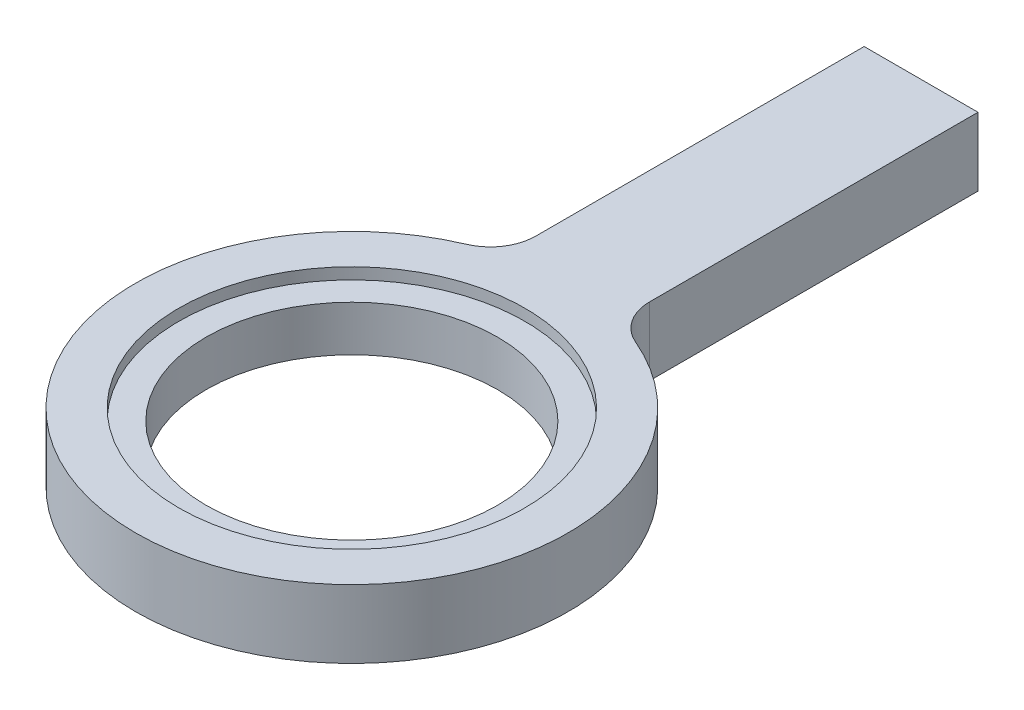
ISO-10303-21;
HEADER;
FILE_DESCRIPTION(('STEP AP214'),'2;1');
FILE_NAME('part.step','',(''),(''),'','','');
FILE_SCHEMA(('AUTOMOTIVE_DESIGN { 1 0 10303 214 1 1 1 1 }'));
ENDSEC;
DATA;
#1=APPLICATION_CONTEXT('core data for automotive mechanical design processes');
#2=APPLICATION_PROTOCOL_DEFINITION('international standard','automotive_design',2000,#1);
#3=PRODUCT_CONTEXT('',#1,'mechanical');
#4=PRODUCT('Part','Part','',(#3));
#5=PRODUCT_RELATED_PRODUCT_CATEGORY('part','',(#4));
#6=PRODUCT_DEFINITION_FORMATION('','',#4);
#7=PRODUCT_DEFINITION_CONTEXT('part definition',#1,'design');
#8=PRODUCT_DEFINITION('design','',#6,#7);
#9=PRODUCT_DEFINITION_SHAPE('','',#8);
#10=(LENGTH_UNIT() NAMED_UNIT(*) SI_UNIT(.MILLI.,.METRE.));
#11=(NAMED_UNIT(*) PLANE_ANGLE_UNIT() SI_UNIT($,.RADIAN.));
#12=(NAMED_UNIT(*) SI_UNIT($,.STERADIAN.) SOLID_ANGLE_UNIT());
#13=UNCERTAINTY_MEASURE_WITH_UNIT(LENGTH_MEASURE(1.E-05),#10,'distance_accuracy_value','');
#14=(GEOMETRIC_REPRESENTATION_CONTEXT(3) GLOBAL_UNCERTAINTY_ASSIGNED_CONTEXT((#13)) GLOBAL_UNIT_ASSIGNED_CONTEXT((#10,
#11,#12)) REPRESENTATION_CONTEXT('',''));
#15=CARTESIAN_POINT('',(0.,0.,0.));
#16=DIRECTION('',(0.,0.,1.));
#17=DIRECTION('',(1.,0.,0.));
#18=AXIS2_PLACEMENT_3D('',#15,#16,#17);
#19=CARTESIAN_POINT('',(0.,2.,0.));
#20=DIRECTION('',(0.,-1.,0.));
#21=DIRECTION('',(0.,0.,-1.));
#22=AXIS2_PLACEMENT_3D('',#19,#20,#21);
#23=CYLINDRICAL_SURFACE('',#22,9.5);
#24=CARTESIAN_POINT('',(0.,2.5,0.));
#25=DIRECTION('',(0.,1.,0.));
#26=DIRECTION('',(0.,0.,1.));
#27=AXIS2_PLACEMENT_3D('',#24,#25,#26);
#28=CIRCLE('',#27,9.5);
#29=CARTESIAN_POINT('',(-3.71739130434783,2.5,-8.742482593083));
#30=VERTEX_POINT('',#29);
#31=CARTESIAN_POINT('',(3.71739130434783,2.5,-8.742482593083));
#32=VERTEX_POINT('',#31);
#33=EDGE_CURVE('E142',#30,#32,#28,.T.);
#34=ORIENTED_EDGE('',*,*,#33,.F.);
#35=DIRECTION('',(0.,-1.,0.));
#36=VECTOR('',#35,1.);
#37=CARTESIAN_POINT('',(-3.71739130434783,2.,-8.742482593083));
#38=LINE('',#37,#36);
#39=CARTESIAN_POINT('',(-3.71739130434783,-0.5,-8.742482593083));
#40=VERTEX_POINT('',#39);
#41=EDGE_CURVE('E156',#30,#40,#38,.T.);
#42=ORIENTED_EDGE('',*,*,#41,.T.);
#43=CARTESIAN_POINT('',(0.,-0.5,0.));
#44=DIRECTION('',(0.,1.,0.));
#45=DIRECTION('',(0.,0.,1.));
#46=AXIS2_PLACEMENT_3D('',#43,#44,#45);
#47=CIRCLE('',#46,9.5);
#48=CARTESIAN_POINT('',(3.71739130434783,-0.5,-8.742482593083));
#49=VERTEX_POINT('',#48);
#50=EDGE_CURVE('E130',#40,#49,#47,.T.);
#51=ORIENTED_EDGE('',*,*,#50,.T.);
#52=DIRECTION('',(0.,-1.,0.));
#53=VECTOR('',#52,1.);
#54=CARTESIAN_POINT('',(3.71739130434783,2.,-8.742482593083));
#55=LINE('',#54,#53);
#56=EDGE_CURVE('E153',#49,#32,#55,.F.);
#57=ORIENTED_EDGE('',*,*,#56,.T.);
#58=EDGE_LOOP('',(#34,#42,#51,#57));
#59=FACE_BOUND('',#58,.T.);
#60=ADVANCED_FACE('F49',(#59),#23,.T.);
#61=CARTESIAN_POINT('',(0.,0.,0.));
#62=DIRECTION('',(0.,1.,0.));
#63=DIRECTION('',(0.,0.,1.));
#64=AXIS2_PLACEMENT_3D('',#61,#62,#63);
#65=PLANE('',#64);
#66=CARTESIAN_POINT('',(0.,0.,0.));
#67=DIRECTION('',(0.,1.,0.));
#68=DIRECTION('',(0.,0.,1.));
#69=AXIS2_PLACEMENT_3D('',#66,#67,#68);
#70=CIRCLE('',#69,6.4);
#71=CARTESIAN_POINT('',(0.,0.,6.4));
#72=VERTEX_POINT('',#71);
#73=EDGE_CURVE('E146',#72,#72,#70,.T.);
#74=ORIENTED_EDGE('',*,*,#73,.T.);
#75=EDGE_LOOP('',(#74));
#76=FACE_BOUND('',#75,.T.);
#77=CARTESIAN_POINT('',(0.,0.,0.));
#78=DIRECTION('',(0.,1.,0.));
#79=DIRECTION('',(0.,0.,1.));
#80=AXIS2_PLACEMENT_3D('',#77,#78,#79);
#81=CIRCLE('',#80,7.6);
#82=CARTESIAN_POINT('',(0.,0.,7.6));
#83=VERTEX_POINT('',#82);
#84=EDGE_CURVE('E131',#83,#83,#81,.T.);
#85=ORIENTED_EDGE('',*,*,#84,.F.);
#86=EDGE_LOOP('',(#85));
#87=FACE_BOUND('',#86,.T.);
#88=ADVANCED_FACE('F184',(#76,#87),#65,.F.);
#89=CARTESIAN_POINT('',(0.,2.,0.));
#90=DIRECTION('',(0.,1.,0.));
#91=DIRECTION('',(0.,0.,1.));
#92=AXIS2_PLACEMENT_3D('',#89,#90,#91);
#93=PLANE('',#92);
#94=CARTESIAN_POINT('',(0.,2.,0.));
#95=DIRECTION('',(0.,1.,0.));
#96=DIRECTION('',(0.,0.,1.));
#97=AXIS2_PLACEMENT_3D('',#94,#95,#96);
#98=CIRCLE('',#97,6.4);
#99=CARTESIAN_POINT('',(0.,2.,6.4));
#100=VERTEX_POINT('',#99);
#101=EDGE_CURVE('E135',#100,#100,#98,.T.);
#102=ORIENTED_EDGE('',*,*,#101,.F.);
#103=EDGE_LOOP('',(#102));
#104=FACE_BOUND('',#103,.T.);
#105=CARTESIAN_POINT('',(0.,2.,0.));
#106=DIRECTION('',(0.,1.,0.));
#107=DIRECTION('',(0.,0.,1.));
#108=AXIS2_PLACEMENT_3D('',#105,#106,#107);
#109=CIRCLE('',#108,7.6);
#110=CARTESIAN_POINT('',(0.,2.,7.6));
#111=VERTEX_POINT('',#110);
#112=EDGE_CURVE('E138',#111,#111,#109,.T.);
#113=ORIENTED_EDGE('',*,*,#112,.T.);
#114=EDGE_LOOP('',(#113));
#115=FACE_BOUND('',#114,.T.);
#116=ADVANCED_FACE('F191',(#104,#115),#93,.T.);
#117=CARTESIAN_POINT('',(0.,2.,0.));
#118=DIRECTION('',(0.,-1.,0.));
#119=DIRECTION('',(0.,0.,-1.));
#120=AXIS2_PLACEMENT_3D('',#117,#118,#119);
#121=CYLINDRICAL_SURFACE('',#120,6.4);
#122=ORIENTED_EDGE('',*,*,#101,.T.);
#123=EDGE_LOOP('',(#122));
#124=FACE_BOUND('',#123,.T.);
#125=ORIENTED_EDGE('',*,*,#73,.F.);
#126=EDGE_LOOP('',(#125));
#127=FACE_BOUND('',#126,.T.);
#128=ADVANCED_FACE('F197',(#124,#127),#121,.F.);
#129=CARTESIAN_POINT('',(0.,2.5,0.));
#130=DIRECTION('',(0.,1.,0.));
#131=DIRECTION('',(0.,0.,1.));
#132=AXIS2_PLACEMENT_3D('',#129,#130,#131);
#133=PLANE('',#132);
#134=DIRECTION('',(0.,0.,-1.));
#135=VECTOR('',#134,1.);
#136=CARTESIAN_POINT('',(-2.5,2.5,0.));
#137=LINE('',#136,#135);
#138=CARTESIAN_POINT('',(-2.5,2.5,-10.5830052442584));
#139=VERTEX_POINT('',#138);
#140=CARTESIAN_POINT('',(-2.5,2.5,-25.));
#141=VERTEX_POINT('',#140);
#142=EDGE_CURVE('E114',#139,#141,#137,.T.);
#143=ORIENTED_EDGE('',*,*,#142,.F.);
#144=CARTESIAN_POINT('',(-4.5,2.5,-10.5830052442584));
#145=DIRECTION('',(0.,1.,0.));
#146=DIRECTION('',(0.,0.,1.));
#147=AXIS2_PLACEMENT_3D('',#144,#145,#146);
#148=CIRCLE('',#147,2.);
#149=EDGE_CURVE('E159',#139,#30,#148,.F.);
#150=ORIENTED_EDGE('',*,*,#149,.T.);
#151=ORIENTED_EDGE('',*,*,#33,.T.);
#152=CARTESIAN_POINT('',(4.5,2.5,-10.5830052442584));
#153=DIRECTION('',(0.,1.,0.));
#154=DIRECTION('',(0.,0.,1.));
#155=AXIS2_PLACEMENT_3D('',#152,#153,#154);
#156=CIRCLE('',#155,2.);
#157=CARTESIAN_POINT('',(2.5,2.5,-10.5830052442584));
#158=VERTEX_POINT('',#157);
#159=EDGE_CURVE('E57',#32,#158,#156,.F.);
#160=ORIENTED_EDGE('',*,*,#159,.T.);
#161=DIRECTION('',(0.,0.,-1.));
#162=VECTOR('',#161,1.);
#163=CARTESIAN_POINT('',(2.5,2.5,0.));
#164=LINE('',#163,#162);
#165=CARTESIAN_POINT('',(2.5,2.5,-25.));
#166=VERTEX_POINT('',#165);
#167=EDGE_CURVE('E99',#158,#166,#164,.T.);
#168=ORIENTED_EDGE('',*,*,#167,.T.);
#169=DIRECTION('',(1.,0.,0.));
#170=VECTOR('',#169,1.);
#171=CARTESIAN_POINT('',(0.,2.5,-25.));
#172=LINE('',#171,#170);
#173=EDGE_CURVE('E105',#141,#166,#172,.T.);
#174=ORIENTED_EDGE('',*,*,#173,.F.);
#175=EDGE_LOOP('',(#143,#150,#151,#160,#168,#174));
#176=FACE_BOUND('',#175,.T.);
#177=CARTESIAN_POINT('',(0.,2.5,0.));
#178=DIRECTION('',(0.,1.,0.));
#179=DIRECTION('',(0.,0.,1.));
#180=AXIS2_PLACEMENT_3D('',#177,#178,#179);
#181=CIRCLE('',#180,7.6);
#182=CARTESIAN_POINT('',(0.,2.5,7.6));
#183=VERTEX_POINT('',#182);
#184=EDGE_CURVE('E139',#183,#183,#181,.T.);
#185=ORIENTED_EDGE('',*,*,#184,.F.);
#186=EDGE_LOOP('',(#185));
#187=FACE_BOUND('',#186,.T.);
#188=ADVANCED_FACE('F102',(#176,#187),#133,.T.);
#189=CARTESIAN_POINT('',(0.,2.5,0.));
#190=DIRECTION('',(0.,-1.,0.));
#191=DIRECTION('',(0.,0.,-1.));
#192=AXIS2_PLACEMENT_3D('',#189,#190,#191);
#193=CYLINDRICAL_SURFACE('',#192,7.6);
#194=ORIENTED_EDGE('',*,*,#184,.T.);
#195=EDGE_LOOP('',(#194));
#196=FACE_BOUND('',#195,.T.);
#197=ORIENTED_EDGE('',*,*,#112,.F.);
#198=EDGE_LOOP('',(#197));
#199=FACE_BOUND('',#198,.T.);
#200=ADVANCED_FACE('F203',(#196,#199),#193,.F.);
#201=CARTESIAN_POINT('',(0.,-0.5,0.));
#202=DIRECTION('',(0.,1.,0.));
#203=DIRECTION('',(0.,0.,1.));
#204=AXIS2_PLACEMENT_3D('',#201,#202,#203);
#205=PLANE('',#204);
#206=CARTESIAN_POINT('',(0.,-0.5,0.));
#207=DIRECTION('',(0.,1.,0.));
#208=DIRECTION('',(0.,0.,1.));
#209=AXIS2_PLACEMENT_3D('',#206,#207,#208);
#210=CIRCLE('',#209,7.6);
#211=CARTESIAN_POINT('',(0.,-0.5,7.6));
#212=VERTEX_POINT('',#211);
#213=EDGE_CURVE('E126',#212,#212,#210,.T.);
#214=ORIENTED_EDGE('',*,*,#213,.T.);
#215=EDGE_LOOP('',(#214));
#216=FACE_BOUND('',#215,.T.);
#217=ORIENTED_EDGE('',*,*,#50,.F.);
#218=CARTESIAN_POINT('',(-4.5,-0.5,-10.5830052442584));
#219=DIRECTION('',(0.,1.,0.));
#220=DIRECTION('',(0.,0.,1.));
#221=AXIS2_PLACEMENT_3D('',#218,#219,#220);
#222=CIRCLE('',#221,2.);
#223=CARTESIAN_POINT('',(-2.5,-0.5,-10.5830052442584));
#224=VERTEX_POINT('',#223);
#225=EDGE_CURVE('E161',#40,#224,#222,.T.);
#226=ORIENTED_EDGE('',*,*,#225,.T.);
#227=DIRECTION('',(0.,0.,1.));
#228=VECTOR('',#227,1.);
#229=CARTESIAN_POINT('',(-2.5,-0.5,0.));
#230=LINE('',#229,#228);
#231=CARTESIAN_POINT('',(-2.5,-0.5,-25.));
#232=VERTEX_POINT('',#231);
#233=EDGE_CURVE('E127',#232,#224,#230,.T.);
#234=ORIENTED_EDGE('',*,*,#233,.F.);
#235=DIRECTION('',(-1.,0.,0.));
#236=VECTOR('',#235,1.);
#237=CARTESIAN_POINT('',(0.,-0.5,-25.));
#238=LINE('',#237,#236);
#239=CARTESIAN_POINT('',(2.5,-0.5,-25.));
#240=VERTEX_POINT('',#239);
#241=EDGE_CURVE('E123',#240,#232,#238,.T.);
#242=ORIENTED_EDGE('',*,*,#241,.F.);
#243=DIRECTION('',(0.,0.,1.));
#244=VECTOR('',#243,1.);
#245=CARTESIAN_POINT('',(2.5,-0.5,0.));
#246=LINE('',#245,#244);
#247=CARTESIAN_POINT('',(2.5,-0.5,-10.5830052442584));
#248=VERTEX_POINT('',#247);
#249=EDGE_CURVE('E110',#240,#248,#246,.T.);
#250=ORIENTED_EDGE('',*,*,#249,.T.);
#251=CARTESIAN_POINT('',(4.5,-0.5,-10.5830052442584));
#252=DIRECTION('',(0.,1.,0.));
#253=DIRECTION('',(0.,0.,1.));
#254=AXIS2_PLACEMENT_3D('',#251,#252,#253);
#255=CIRCLE('',#254,2.);
#256=EDGE_CURVE('E12',#248,#49,#255,.T.);
#257=ORIENTED_EDGE('',*,*,#256,.T.);
#258=EDGE_LOOP('',(#217,#226,#234,#242,#250,#257));
#259=FACE_BOUND('',#258,.T.);
#260=ADVANCED_FACE('F166',(#216,#259),#205,.F.);
#261=CARTESIAN_POINT('',(0.,-0.5,0.));
#262=DIRECTION('',(0.,1.,0.));
#263=DIRECTION('',(0.,0.,1.));
#264=AXIS2_PLACEMENT_3D('',#261,#262,#263);
#265=CYLINDRICAL_SURFACE('',#264,7.6);
#266=ORIENTED_EDGE('',*,*,#213,.F.);
#267=EDGE_LOOP('',(#266));
#268=FACE_BOUND('',#267,.T.);
#269=ORIENTED_EDGE('',*,*,#84,.T.);
#270=EDGE_LOOP('',(#269));
#271=FACE_BOUND('',#270,.T.);
#272=ADVANCED_FACE('F209',(#268,#271),#265,.F.);
#273=CARTESIAN_POINT('',(-2.5,-17.1054939855584,0.));
#274=DIRECTION('',(1.,0.,0.));
#275=DIRECTION('',(0.,0.,-1.));
#276=AXIS2_PLACEMENT_3D('',#273,#274,#275);
#277=PLANE('',#276);
#278=ORIENTED_EDGE('',*,*,#233,.T.);
#279=DIRECTION('',(0.,1.,0.));
#280=VECTOR('',#279,1.);
#281=CARTESIAN_POINT('',(-2.5,2.5,-10.5830052442584));
#282=LINE('',#281,#280);
#283=EDGE_CURVE('E134',#224,#139,#282,.T.);
#284=ORIENTED_EDGE('',*,*,#283,.T.);
#285=ORIENTED_EDGE('',*,*,#142,.T.);
#286=DIRECTION('',(0.,1.,0.));
#287=VECTOR('',#286,1.);
#288=CARTESIAN_POINT('',(-2.5,-17.1054939855584,-25.));
#289=LINE('',#288,#287);
#290=EDGE_CURVE('E113',#232,#141,#289,.T.);
#291=ORIENTED_EDGE('',*,*,#290,.F.);
#292=EDGE_LOOP('',(#278,#284,#285,#291));
#293=FACE_BOUND('',#292,.T.);
#294=ADVANCED_FACE('F171',(#293),#277,.F.);
#295=CARTESIAN_POINT('',(0.,-17.1054939855584,-25.));
#296=DIRECTION('',(0.,0.,1.));
#297=DIRECTION('',(1.,0.,0.));
#298=AXIS2_PLACEMENT_3D('',#295,#296,#297);
#299=PLANE('',#298);
#300=DIRECTION('',(0.,1.,0.));
#301=VECTOR('',#300,1.);
#302=CARTESIAN_POINT('',(2.5,-17.1054939855584,-25.));
#303=LINE('',#302,#301);
#304=EDGE_CURVE('E108',#240,#166,#303,.T.);
#305=ORIENTED_EDGE('',*,*,#304,.F.);
#306=ORIENTED_EDGE('',*,*,#241,.T.);
#307=ORIENTED_EDGE('',*,*,#290,.T.);
#308=ORIENTED_EDGE('',*,*,#173,.T.);
#309=EDGE_LOOP('',(#305,#306,#307,#308));
#310=FACE_BOUND('',#309,.T.);
#311=ADVANCED_FACE('F117',(#310),#299,.F.);
#312=CARTESIAN_POINT('',(2.5,-17.1054939855584,0.));
#313=DIRECTION('',(1.,0.,0.));
#314=DIRECTION('',(0.,0.,-1.));
#315=AXIS2_PLACEMENT_3D('',#312,#313,#314);
#316=PLANE('',#315);
#317=ORIENTED_EDGE('',*,*,#167,.F.);
#318=DIRECTION('',(0.,-1.,0.));
#319=VECTOR('',#318,1.);
#320=CARTESIAN_POINT('',(2.5,-17.1054939855584,-10.5830052442584));
#321=LINE('',#320,#319);
#322=EDGE_CURVE('E70',#158,#248,#321,.T.);
#323=ORIENTED_EDGE('',*,*,#322,.T.);
#324=ORIENTED_EDGE('',*,*,#249,.F.);
#325=ORIENTED_EDGE('',*,*,#304,.T.);
#326=EDGE_LOOP('',(#317,#323,#324,#325));
#327=FACE_BOUND('',#326,.T.);
#328=ADVANCED_FACE('F109',(#327),#316,.T.);
#329=CARTESIAN_POINT('',(-4.5,2.,-10.5830052442584));
#330=DIRECTION('',(0.,-1.,0.));
#331=DIRECTION('',(0.,0.,-1.));
#332=AXIS2_PLACEMENT_3D('',#329,#330,#331);
#333=CYLINDRICAL_SURFACE('',#332,2.);
#334=ORIENTED_EDGE('',*,*,#225,.F.);
#335=ORIENTED_EDGE('',*,*,#41,.F.);
#336=ORIENTED_EDGE('',*,*,#149,.F.);
#337=ORIENTED_EDGE('',*,*,#283,.F.);
#338=EDGE_LOOP('',(#334,#335,#336,#337));
#339=FACE_BOUND('',#338,.T.);
#340=ADVANCED_FACE('F172',(#339),#333,.F.);
#341=CARTESIAN_POINT('',(4.5,2.,-10.5830052442584));
#342=DIRECTION('',(0.,-1.,0.));
#343=DIRECTION('',(0.,0.,-1.));
#344=AXIS2_PLACEMENT_3D('',#341,#342,#343);
#345=CYLINDRICAL_SURFACE('',#344,2.);
#346=ORIENTED_EDGE('',*,*,#256,.F.);
#347=ORIENTED_EDGE('',*,*,#322,.F.);
#348=ORIENTED_EDGE('',*,*,#159,.F.);
#349=ORIENTED_EDGE('',*,*,#56,.F.);
#350=EDGE_LOOP('',(#346,#347,#348,#349));
#351=FACE_BOUND('',#350,.T.);
#352=ADVANCED_FACE('F51',(#351),#345,.F.);
#353=CLOSED_SHELL('',(#60,#88,#116,#128,#188,#200,#260,#272,#294,#311,#328,#340,#352));
#354=MANIFOLD_SOLID_BREP('B2',#353);
#355=ADVANCED_BREP_SHAPE_REPRESENTATION('',(#18,#354),#14);
#356=SHAPE_DEFINITION_REPRESENTATION(#9,#355);
ENDSEC;
END-ISO-10303-21;
